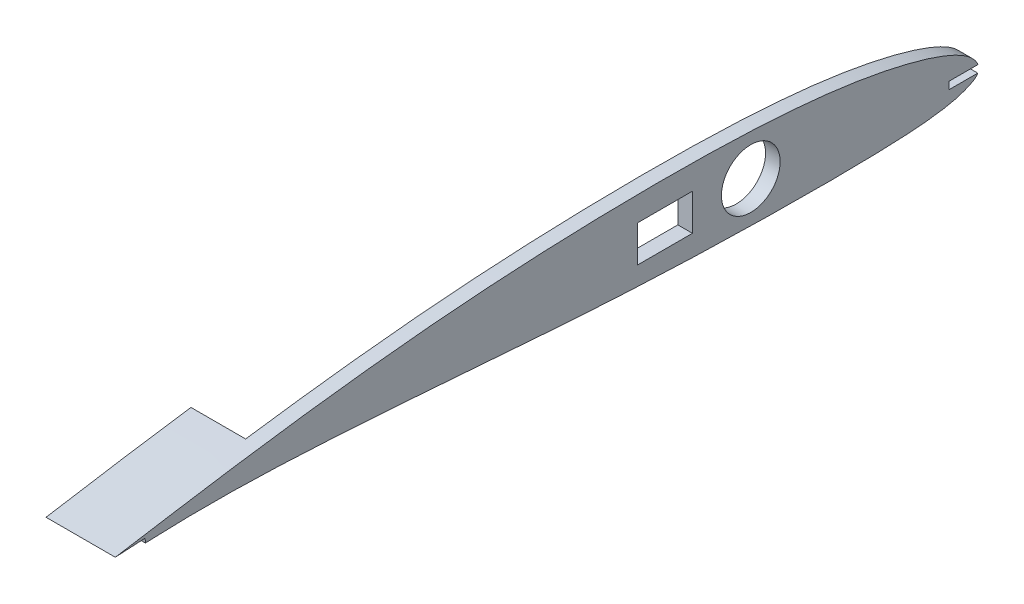
ISO-10303-21;
HEADER;
FILE_DESCRIPTION(('STEP AP214'),'2;1');
FILE_NAME('part.step','',(''),(''),'','','');
FILE_SCHEMA(('AUTOMOTIVE_DESIGN { 1 0 10303 214 1 1 1 1 }'));
ENDSEC;
DATA;
#1=APPLICATION_CONTEXT('core data for automotive mechanical design processes');
#2=APPLICATION_PROTOCOL_DEFINITION('international standard','automotive_design',2000,#1);
#3=PRODUCT_CONTEXT('',#1,'mechanical');
#4=PRODUCT('Part','Part','',(#3));
#5=PRODUCT_RELATED_PRODUCT_CATEGORY('part','',(#4));
#6=PRODUCT_DEFINITION_FORMATION('','',#4);
#7=PRODUCT_DEFINITION_CONTEXT('part definition',#1,'design');
#8=PRODUCT_DEFINITION('design','',#6,#7);
#9=PRODUCT_DEFINITION_SHAPE('','',#8);
#10=(LENGTH_UNIT() NAMED_UNIT(*) SI_UNIT(.MILLI.,.METRE.));
#11=(NAMED_UNIT(*) PLANE_ANGLE_UNIT() SI_UNIT($,.RADIAN.));
#12=(NAMED_UNIT(*) SI_UNIT($,.STERADIAN.) SOLID_ANGLE_UNIT());
#13=UNCERTAINTY_MEASURE_WITH_UNIT(LENGTH_MEASURE(1.E-05),#10,'distance_accuracy_value','');
#14=(GEOMETRIC_REPRESENTATION_CONTEXT(3) GLOBAL_UNCERTAINTY_ASSIGNED_CONTEXT((#13)) GLOBAL_UNIT_ASSIGNED_CONTEXT((#10,
#11,#12)) REPRESENTATION_CONTEXT('',''));
#15=CARTESIAN_POINT('',(0.,0.,0.));
#16=DIRECTION('',(0.,0.,1.));
#17=DIRECTION('',(1.,0.,0.));
#18=AXIS2_PLACEMENT_3D('',#15,#16,#17);
#19=CARTESIAN_POINT('',(4.,0.,250.));
#20=CARTESIAN_POINT('',(4.,-0.0080427959719715,250.000228293678));
#21=CARTESIAN_POINT('',(4.,0.172375657967406,248.284955515532));
#22=CARTESIAN_POINT('',(4.,0.308690014795419,246.518112419387));
#23=CARTESIAN_POINT('',(4.,0.685693593852336,242.189387343398));
#24=CARTESIAN_POINT('',(4.,1.07410152891603,236.806461263496));
#25=CARTESIAN_POINT('',(4.,1.49731723995003,229.680385951639));
#26=CARTESIAN_POINT('',(4.,1.8232186026768,221.18415869828));
#27=CARTESIAN_POINT('',(4.,1.96762610068065,211.337618207726));
#28=CARTESIAN_POINT('',(4.,1.83322105638369,200.371188527109));
#29=CARTESIAN_POINT('',(4.,1.38960528984164,188.499913622482));
#30=CARTESIAN_POINT('',(4.,0.706014078000893,175.953687417433));
#31=CARTESIAN_POINT('',(4.,-0.160208641561513,162.931424917666));
#32=CARTESIAN_POINT('',(4.,-1.14801632724376,149.615771743617));
#33=CARTESIAN_POINT('',(4.,-2.19092490983926,136.176354994724));
#34=CARTESIAN_POINT('',(4.,-3.21958397917046,122.767140548026));
#35=CARTESIAN_POINT('',(4.,-4.15274312671142,109.520053587455));
#36=CARTESIAN_POINT('',(4.,-4.93856436487493,96.5460959745437));
#37=CARTESIAN_POINT('',(4.,-5.53683070268675,83.9408193016427));
#38=CARTESIAN_POINT('',(4.,-5.94764820461108,71.8018392906514));
#39=CARTESIAN_POINT('',(4.,-6.21845093878312,60.2452560030716));
#40=CARTESIAN_POINT('',(4.,-6.35536975583973,49.3987328907547));
#41=CARTESIAN_POINT('',(4.,-6.38138796281789,39.3972261942655));
#42=CARTESIAN_POINT('',(4.,-6.26504923032313,30.3619348419668));
#43=CARTESIAN_POINT('',(4.,-6.01216491688521,22.4121811031587));
#44=CARTESIAN_POINT('',(4.,-5.59743390072595,15.6262272306516));
#45=CARTESIAN_POINT('',(4.,-4.92870657935606,10.0719075109048));
#46=CARTESIAN_POINT('',(4.,-4.04044698146404,5.69769261214423));
#47=CARTESIAN_POINT('',(4.,-2.8657529844069,2.62532063874475));
#48=CARTESIAN_POINT('',(4.,-1.7115284699546,0.494884225045661));
#49=CARTESIAN_POINT('',(4.,-0.410454230626488,-0.0213125491030087));
#50=CARTESIAN_POINT('',(4.,0.792659826704065,0.0311691995850224));
#51=CARTESIAN_POINT('',(4.,2.30568433693192,0.812599241892923));
#52=CARTESIAN_POINT('',(4.,4.23835242447377,2.72886351673443));
#53=CARTESIAN_POINT('',(4.,6.11817212106947,5.76990724125498));
#54=CARTESIAN_POINT('',(4.,7.91359420170391,9.88094280419771));
#55=CARTESIAN_POINT('',(4.,9.64131817838287,15.0749304677094));
#56=CARTESIAN_POINT('',(4.,11.2838964878058,21.2987522216172));
#57=CARTESIAN_POINT('',(4.,12.7883817585812,28.4971721202648));
#58=CARTESIAN_POINT('',(4.,14.0978349081275,36.6073734062479));
#59=CARTESIAN_POINT('',(4.,15.1594290171638,45.573028440303));
#60=CARTESIAN_POINT('',(4.,15.9609039979753,55.3329100744701));
#61=CARTESIAN_POINT('',(4.,16.4940697383882,65.8165364983871));
#62=CARTESIAN_POINT('',(4.,16.7919897051422,76.9313762604552));
#63=CARTESIAN_POINT('',(4.,16.864754130909,88.5669490281142));
#64=CARTESIAN_POINT('',(4.,16.7267152914356,100.596999885542));
#65=CARTESIAN_POINT('',(4.,16.3833850637257,112.888825982424));
#66=CARTESIAN_POINT('',(4.,15.825573666627,125.31161581915));
#67=CARTESIAN_POINT('',(4.,15.0523318700684,137.743791097076));
#68=CARTESIAN_POINT('',(4.,14.0593390742259,150.072384382085));
#69=CARTESIAN_POINT('',(4.,12.8815869860292,162.191375055682));
#70=CARTESIAN_POINT('',(4.,11.5492803460744,173.989074322246));
#71=CARTESIAN_POINT('',(4.,10.1162497290333,185.35236444642));
#72=CARTESIAN_POINT('',(4.,8.63237912523508,196.163081697706));
#73=CARTESIAN_POINT('',(4.,7.13151388385034,206.300441402258));
#74=CARTESIAN_POINT('',(4.,5.73122176805054,215.560350587015));
#75=CARTESIAN_POINT('',(4.,4.29329512716244,223.97715704258));
#76=CARTESIAN_POINT('',(4.,3.1818088737293,231.363413336396));
#77=CARTESIAN_POINT('',(4.,2.09894241729889,237.746440904332));
#78=CARTESIAN_POINT('',(4.,1.2458619166603,242.622069365861));
#79=CARTESIAN_POINT('',(4.,0.552864946230777,246.64452933247));
#80=CARTESIAN_POINT('',(4.,0.246216764640028,248.328398440367));
#81=CARTESIAN_POINT('',(4.,0.00797737724443801,249.999773563223));
#82=CARTESIAN_POINT('',(4.,0.,250.));
#83=B_SPLINE_CURVE_WITH_KNOTS('',3,(#19,#20,#21,#22,#23,#24,#25,#26,#27,#28,#29,#30,#31,#32,#33,
#34,#35,#36,#37,#38,#39,#40,#41,#42,#43,#44,#45,#46,#47,#48,#49,#50,#51,#52,#53,#54,#55,#56,#57,
#58,#59,#60,#61,#62,#63,#64,#65,#66,#67,#68,#69,#70,#71,#72,#73,#74,#75,#76,#77,#78,#79,#80,#81,
#82),.UNSPECIFIED.,.T.,.F.,(4,1,1,1,1,1,1,1,1,1,1,1,1,1,1,1,1,1,1,1,1,1,1,1,1,1,1,1,1,1,1,1,1,1,
1,1,1,1,1,1,1,1,1,1,1,1,1,1,1,1,1,1,1,1,1,1,1,1,1,1,1,4),(0.,0.00158888881614516,
0.00632921783555629,0.0142024564897436,0.0251728077530557,0.0391734833267743,0.0560606311759249,
0.0755789238487882,0.0973636066296903,0.120926258366677,0.145825281006277,0.171670911815127,
0.198108536705041,0.22479018357162,0.25139057978404,0.277643490654311,0.303326750051388,
0.328257458029316,0.352272548115194,0.375156061746876,0.396620664402003,0.416422729294005,
0.434304420097656,0.450054679859308,0.463465465082325,0.474478994238096,0.483169222153171,
0.489678354497499,0.494104066315722,0.496910015324886,0.497289784891853,0.501214273282496,
0.506457950332762,0.51335695674223,0.522168631834455,0.53296596992453,0.545689209241574,
0.56022077890382,0.57643892310517,0.594258689005965,0.613600244568652,0.634342385932902,
0.656331109263004,0.679351893859712,0.703152302846811,0.727478208080039,0.7520707394079,
0.776691163534608,0.801140183976245,0.825214386971546,0.848697423570622,0.871352857669295,
0.892947448931157,0.913230871058069,0.931955467148994,0.94834206907442,0.963693004275676,
0.976235918239566,0.986320058750392,0.993788799349345,0.998424034933867,1.),.UNSPECIFIED.);
#84=DIRECTION('',(-1.,0.,0.));
#85=VECTOR('',#84,1.);
#86=SURFACE_OF_LINEAR_EXTRUSION('',#83,#85);
#87=CARTESIAN_POINT('',(4.,1.52622001669928,228.477241343692));
#88=VERTEX_POINT('',#87);
#89=CARTESIAN_POINT('',(4.,-1.00000519343501,0.266537777160356));
#90=VERTEX_POINT('',#89);
#91=EDGE_CURVE('E189',#88,#90,#83,.T.);
#92=ORIENTED_EDGE('',*,*,#91,.F.);
#93=DIRECTION('',(1.,0.,0.));
#94=VECTOR('',#93,1.);
#95=CARTESIAN_POINT('',(-15.,1.52622001669928,228.477241343692));
#96=LINE('',#95,#94);
#97=CARTESIAN_POINT('',(-15.,1.52622001669928,228.477241343692));
#98=VERTEX_POINT('',#97);
#99=EDGE_CURVE('E357',#98,#88,#96,.T.);
#100=ORIENTED_EDGE('',*,*,#99,.F.);
#101=CARTESIAN_POINT('',(-15.,0.,250.));
#102=CARTESIAN_POINT('',(-15.,-0.0080427959719715,250.000228293678));
#103=CARTESIAN_POINT('',(-15.,0.172375657967406,248.284955515532));
#104=CARTESIAN_POINT('',(-15.,0.308690014795419,246.518112419387));
#105=CARTESIAN_POINT('',(-15.,0.685693593852336,242.189387343398));
#106=CARTESIAN_POINT('',(-15.,1.07410152891603,236.806461263496));
#107=CARTESIAN_POINT('',(-15.,1.49731723995003,229.680385951639));
#108=CARTESIAN_POINT('',(-15.,1.8232186026768,221.18415869828));
#109=CARTESIAN_POINT('',(-15.,1.96762610068065,211.337618207726));
#110=CARTESIAN_POINT('',(-15.,1.83322105638369,200.371188527109));
#111=CARTESIAN_POINT('',(-15.,1.38960528984164,188.499913622482));
#112=CARTESIAN_POINT('',(-15.,0.706014078000893,175.953687417433));
#113=CARTESIAN_POINT('',(-15.,-0.160208641561513,162.931424917666));
#114=CARTESIAN_POINT('',(-15.,-1.14801632724376,149.615771743617));
#115=CARTESIAN_POINT('',(-15.,-2.19092490983926,136.176354994724));
#116=CARTESIAN_POINT('',(-15.,-3.21958397917046,122.767140548026));
#117=CARTESIAN_POINT('',(-15.,-4.15274312671142,109.520053587455));
#118=CARTESIAN_POINT('',(-15.,-4.93856436487493,96.5460959745437));
#119=CARTESIAN_POINT('',(-15.,-5.53683070268675,83.9408193016427));
#120=CARTESIAN_POINT('',(-15.,-5.94764820461108,71.8018392906514));
#121=CARTESIAN_POINT('',(-15.,-6.21845093878312,60.2452560030716));
#122=CARTESIAN_POINT('',(-15.,-6.35536975583973,49.3987328907547));
#123=CARTESIAN_POINT('',(-15.,-6.38138796281789,39.3972261942655));
#124=CARTESIAN_POINT('',(-15.,-6.26504923032313,30.3619348419668));
#125=CARTESIAN_POINT('',(-15.,-6.01216491688521,22.4121811031587));
#126=CARTESIAN_POINT('',(-15.,-5.59743390072595,15.6262272306516));
#127=CARTESIAN_POINT('',(-15.,-4.92870657935606,10.0719075109048));
#128=CARTESIAN_POINT('',(-15.,-4.04044698146404,5.69769261214423));
#129=CARTESIAN_POINT('',(-15.,-2.8657529844069,2.62532063874475));
#130=CARTESIAN_POINT('',(-15.,-1.7115284699546,0.494884225045661));
#131=CARTESIAN_POINT('',(-15.,-0.410454230626488,-0.0213125491030087));
#132=CARTESIAN_POINT('',(-15.,0.792659826704065,0.0311691995850224));
#133=CARTESIAN_POINT('',(-15.,2.30568433693192,0.812599241892923));
#134=CARTESIAN_POINT('',(-15.,4.23835242447377,2.72886351673443));
#135=CARTESIAN_POINT('',(-15.,6.11817212106947,5.76990724125498));
#136=CARTESIAN_POINT('',(-15.,7.91359420170391,9.88094280419771));
#137=CARTESIAN_POINT('',(-15.,9.64131817838287,15.0749304677094));
#138=CARTESIAN_POINT('',(-15.,11.2838964878058,21.2987522216172));
#139=CARTESIAN_POINT('',(-15.,12.7883817585812,28.4971721202648));
#140=CARTESIAN_POINT('',(-15.,14.0978349081275,36.6073734062479));
#141=CARTESIAN_POINT('',(-15.,15.1594290171638,45.573028440303));
#142=CARTESIAN_POINT('',(-15.,15.9609039979753,55.3329100744701));
#143=CARTESIAN_POINT('',(-15.,16.4940697383882,65.8165364983871));
#144=CARTESIAN_POINT('',(-15.,16.7919897051422,76.9313762604552));
#145=CARTESIAN_POINT('',(-15.,16.864754130909,88.5669490281142));
#146=CARTESIAN_POINT('',(-15.,16.7267152914356,100.596999885542));
#147=CARTESIAN_POINT('',(-15.,16.3833850637257,112.888825982424));
#148=CARTESIAN_POINT('',(-15.,15.825573666627,125.31161581915));
#149=CARTESIAN_POINT('',(-15.,15.0523318700684,137.743791097076));
#150=CARTESIAN_POINT('',(-15.,14.0593390742259,150.072384382085));
#151=CARTESIAN_POINT('',(-15.,12.8815869860292,162.191375055682));
#152=CARTESIAN_POINT('',(-15.,11.5492803460744,173.989074322246));
#153=CARTESIAN_POINT('',(-15.,10.1162497290333,185.35236444642));
#154=CARTESIAN_POINT('',(-15.,8.63237912523508,196.163081697706));
#155=CARTESIAN_POINT('',(-15.,7.13151388385034,206.300441402258));
#156=CARTESIAN_POINT('',(-15.,5.73122176805054,215.560350587015));
#157=CARTESIAN_POINT('',(-15.,4.29329512716244,223.97715704258));
#158=CARTESIAN_POINT('',(-15.,3.1818088737293,231.363413336396));
#159=CARTESIAN_POINT('',(-15.,2.09894241729889,237.746440904332));
#160=CARTESIAN_POINT('',(-15.,1.2458619166603,242.622069365861));
#161=CARTESIAN_POINT('',(-15.,0.552864946230777,246.64452933247));
#162=CARTESIAN_POINT('',(-15.,0.246216764640028,248.328398440367));
#163=CARTESIAN_POINT('',(-15.,0.00797737724443801,249.999773563223));
#164=CARTESIAN_POINT('',(-15.,0.,250.));
#165=B_SPLINE_CURVE_WITH_KNOTS('',3,(#101,#102,#103,#104,#105,#106,#107,#108,#109,#110,#111,
#112,#113,#114,#115,#116,#117,#118,#119,#120,#121,#122,#123,#124,#125,#126,#127,#128,#129,#130,
#131,#132,#133,#134,#135,#136,#137,#138,#139,#140,#141,#142,#143,#144,#145,#146,#147,#148,#149,
#150,#151,#152,#153,#154,#155,#156,#157,#158,#159,#160,#161,#162,#163,#164),.UNSPECIFIED.,.T.,
.F.,(4,1,1,1,1,1,1,1,1,1,1,1,1,1,1,1,1,1,1,1,1,1,1,1,1,1,1,1,1,1,1,1,1,1,1,1,1,1,1,1,1,1,1,1,1,
1,1,1,1,1,1,1,1,1,1,1,1,1,1,1,1,4),(0.,0.00158888881614516,0.00632921783555629,
0.0142024564897436,0.0251728077530557,0.0391734833267743,0.0560606311759249,0.0755789238487882,
0.0973636066296903,0.120926258366677,0.145825281006277,0.171670911815127,0.198108536705041,
0.22479018357162,0.25139057978404,0.277643490654311,0.303326750051388,0.328257458029316,
0.352272548115194,0.375156061746876,0.396620664402003,0.416422729294005,0.434304420097656,
0.450054679859308,0.463465465082325,0.474478994238096,0.483169222153171,0.489678354497499,
0.494104066315722,0.496910015324886,0.497289784891853,0.501214273282496,0.506457950332762,
0.51335695674223,0.522168631834455,0.53296596992453,0.545689209241574,0.56022077890382,
0.57643892310517,0.594258689005965,0.613600244568652,0.634342385932902,0.656331109263004,
0.679351893859712,0.703152302846811,0.727478208080039,0.7520707394079,0.776691163534608,
0.801140183976245,0.825214386971546,0.848697423570622,0.871352857669295,0.892947448931157,
0.913230871058069,0.931955467148994,0.94834206907442,0.963693004275676,0.976235918239566,
0.986320058750392,0.993788799349345,0.998424034933867,1.),.UNSPECIFIED.);
#166=CARTESIAN_POINT('',(-15.,1.68901098706519,197.));
#167=VERTEX_POINT('',#166);
#168=EDGE_CURVE('E350',#98,#167,#165,.T.);
#169=ORIENTED_EDGE('',*,*,#168,.T.);
#170=DIRECTION('',(-1.,0.,0.));
#171=VECTOR('',#170,1.);
#172=CARTESIAN_POINT('',(-34.3382300855436,1.68901098706519,197.));
#173=LINE('',#172,#171);
#174=CARTESIAN_POINT('',(0.,1.68901098706519,197.));
#175=VERTEX_POINT('',#174);
#176=EDGE_CURVE('E226',#167,#175,#173,.F.);
#177=ORIENTED_EDGE('',*,*,#176,.T.);
#178=CARTESIAN_POINT('',(0.,0.,250.));
#179=CARTESIAN_POINT('',(0.,-0.0080427959719715,250.000228293678));
#180=CARTESIAN_POINT('',(0.,0.172375657967406,248.284955515532));
#181=CARTESIAN_POINT('',(0.,0.308690014795419,246.518112419387));
#182=CARTESIAN_POINT('',(0.,0.685693593852336,242.189387343398));
#183=CARTESIAN_POINT('',(0.,1.07410152891603,236.806461263496));
#184=CARTESIAN_POINT('',(0.,1.49731723995003,229.680385951639));
#185=CARTESIAN_POINT('',(0.,1.8232186026768,221.18415869828));
#186=CARTESIAN_POINT('',(0.,1.96762610068065,211.337618207726));
#187=CARTESIAN_POINT('',(0.,1.83322105638369,200.371188527109));
#188=CARTESIAN_POINT('',(0.,1.38960528984164,188.499913622482));
#189=CARTESIAN_POINT('',(0.,0.706014078000893,175.953687417433));
#190=CARTESIAN_POINT('',(0.,-0.160208641561513,162.931424917666));
#191=CARTESIAN_POINT('',(0.,-1.14801632724376,149.615771743617));
#192=CARTESIAN_POINT('',(0.,-2.19092490983926,136.176354994724));
#193=CARTESIAN_POINT('',(0.,-3.21958397917046,122.767140548026));
#194=CARTESIAN_POINT('',(0.,-4.15274312671142,109.520053587455));
#195=CARTESIAN_POINT('',(0.,-4.93856436487493,96.5460959745437));
#196=CARTESIAN_POINT('',(0.,-5.53683070268675,83.9408193016427));
#197=CARTESIAN_POINT('',(0.,-5.94764820461108,71.8018392906514));
#198=CARTESIAN_POINT('',(0.,-6.21845093878312,60.2452560030716));
#199=CARTESIAN_POINT('',(0.,-6.35536975583973,49.3987328907547));
#200=CARTESIAN_POINT('',(0.,-6.38138796281789,39.3972261942655));
#201=CARTESIAN_POINT('',(0.,-6.26504923032313,30.3619348419668));
#202=CARTESIAN_POINT('',(0.,-6.01216491688521,22.4121811031587));
#203=CARTESIAN_POINT('',(0.,-5.59743390072595,15.6262272306516));
#204=CARTESIAN_POINT('',(0.,-4.92870657935606,10.0719075109048));
#205=CARTESIAN_POINT('',(0.,-4.04044698146404,5.69769261214423));
#206=CARTESIAN_POINT('',(0.,-2.8657529844069,2.62532063874475));
#207=CARTESIAN_POINT('',(0.,-1.7115284699546,0.494884225045661));
#208=CARTESIAN_POINT('',(0.,-0.410454230626488,-0.0213125491030087));
#209=CARTESIAN_POINT('',(0.,0.792659826704065,0.0311691995850224));
#210=CARTESIAN_POINT('',(0.,2.30568433693192,0.812599241892923));
#211=CARTESIAN_POINT('',(0.,4.23835242447377,2.72886351673443));
#212=CARTESIAN_POINT('',(0.,6.11817212106947,5.76990724125498));
#213=CARTESIAN_POINT('',(0.,7.91359420170391,9.88094280419771));
#214=CARTESIAN_POINT('',(0.,9.64131817838287,15.0749304677094));
#215=CARTESIAN_POINT('',(0.,11.2838964878058,21.2987522216172));
#216=CARTESIAN_POINT('',(0.,12.7883817585812,28.4971721202648));
#217=CARTESIAN_POINT('',(0.,14.0978349081275,36.6073734062479));
#218=CARTESIAN_POINT('',(0.,15.1594290171638,45.573028440303));
#219=CARTESIAN_POINT('',(0.,15.9609039979753,55.3329100744701));
#220=CARTESIAN_POINT('',(0.,16.4940697383882,65.8165364983871));
#221=CARTESIAN_POINT('',(0.,16.7919897051422,76.9313762604552));
#222=CARTESIAN_POINT('',(0.,16.864754130909,88.5669490281142));
#223=CARTESIAN_POINT('',(0.,16.7267152914356,100.596999885542));
#224=CARTESIAN_POINT('',(0.,16.3833850637257,112.888825982424));
#225=CARTESIAN_POINT('',(0.,15.825573666627,125.31161581915));
#226=CARTESIAN_POINT('',(0.,15.0523318700684,137.743791097076));
#227=CARTESIAN_POINT('',(0.,14.0593390742259,150.072384382085));
#228=CARTESIAN_POINT('',(0.,12.8815869860292,162.191375055682));
#229=CARTESIAN_POINT('',(0.,11.5492803460744,173.989074322246));
#230=CARTESIAN_POINT('',(0.,10.1162497290333,185.35236444642));
#231=CARTESIAN_POINT('',(0.,8.63237912523508,196.163081697706));
#232=CARTESIAN_POINT('',(0.,7.13151388385034,206.300441402258));
#233=CARTESIAN_POINT('',(0.,5.73122176805054,215.560350587015));
#234=CARTESIAN_POINT('',(0.,4.29329512716244,223.97715704258));
#235=CARTESIAN_POINT('',(0.,3.1818088737293,231.363413336396));
#236=CARTESIAN_POINT('',(0.,2.09894241729889,237.746440904332));
#237=CARTESIAN_POINT('',(0.,1.2458619166603,242.622069365861));
#238=CARTESIAN_POINT('',(0.,0.552864946230777,246.64452933247));
#239=CARTESIAN_POINT('',(0.,0.246216764640028,248.328398440367));
#240=CARTESIAN_POINT('',(0.,0.00797737724443801,249.999773563223));
#241=CARTESIAN_POINT('',(0.,0.,250.));
#242=B_SPLINE_CURVE_WITH_KNOTS('',3,(#178,#179,#180,#181,#182,#183,#184,#185,#186,#187,#188,
#189,#190,#191,#192,#193,#194,#195,#196,#197,#198,#199,#200,#201,#202,#203,#204,#205,#206,#207,
#208,#209,#210,#211,#212,#213,#214,#215,#216,#217,#218,#219,#220,#221,#222,#223,#224,#225,#226,
#227,#228,#229,#230,#231,#232,#233,#234,#235,#236,#237,#238,#239,#240,#241),.UNSPECIFIED.,.T.,
.F.,(4,1,1,1,1,1,1,1,1,1,1,1,1,1,1,1,1,1,1,1,1,1,1,1,1,1,1,1,1,1,1,1,1,1,1,1,1,1,1,1,1,1,1,1,1,
1,1,1,1,1,1,1,1,1,1,1,1,1,1,1,1,4),(0.,0.00158888881614516,0.00632921783555629,
0.0142024564897436,0.0251728077530557,0.0391734833267743,0.0560606311759249,0.0755789238487882,
0.0973636066296903,0.120926258366677,0.145825281006277,0.171670911815127,0.198108536705041,
0.22479018357162,0.25139057978404,0.277643490654311,0.303326750051388,0.328257458029316,
0.352272548115194,0.375156061746876,0.396620664402003,0.416422729294005,0.434304420097656,
0.450054679859308,0.463465465082325,0.474478994238096,0.483169222153171,0.489678354497499,
0.494104066315722,0.496910015324886,0.497289784891853,0.501214273282496,0.506457950332762,
0.51335695674223,0.522168631834455,0.53296596992453,0.545689209241574,0.56022077890382,
0.57643892310517,0.594258689005965,0.613600244568652,0.634342385932902,0.656331109263004,
0.679351893859712,0.703152302846811,0.727478208080039,0.7520707394079,0.776691163534608,
0.801140183976245,0.825214386971546,0.848697423570622,0.871352857669295,0.892947448931157,
0.913230871058069,0.931955467148994,0.94834206907442,0.963693004275676,0.976235918239566,
0.986320058750392,0.993788799349345,0.998424034933867,1.),.UNSPECIFIED.);
#243=CARTESIAN_POINT('',(0.,-1.00000519343501,0.266537777160356));
#244=VERTEX_POINT('',#243);
#245=EDGE_CURVE('E80',#175,#244,#242,.T.);
#246=ORIENTED_EDGE('',*,*,#245,.T.);
#247=DIRECTION('',(-1.,0.,0.));
#248=VECTOR('',#247,1.);
#249=CARTESIAN_POINT('',(4.,-1.00000519343502,0.266537770752891));
#250=LINE('',#249,#248);
#251=EDGE_CURVE('E12',#244,#90,#250,.F.);
#252=ORIENTED_EDGE('',*,*,#251,.T.);
#253=EDGE_LOOP('',(#92,#100,#169,#177,#246,#252));
#254=FACE_BOUND('',#253,.T.);
#255=ADVANCED_FACE('F56',(#254),#86,.F.);
#256=CARTESIAN_POINT('',(0.,1.49711132773622,0.435092083404368));
#257=DIRECTION('',(-1.,0.,0.));
#258=DIRECTION('',(0.,0.,1.));
#259=AXIS2_PLACEMENT_3D('',#256,#257,#258);
#260=PLANE('',#259);
#261=CARTESIAN_POINT('',(0.,5.07732270373844,62.4999197093942));
#262=DIRECTION('',(1.,0.,0.));
#263=DIRECTION('',(0.,0.,-1.));
#264=AXIS2_PLACEMENT_3D('',#261,#262,#263);
#265=CIRCLE('',#264,8.05);
#266=CARTESIAN_POINT('',(0.,5.07732270373844,54.4499197093942));
#267=VERTEX_POINT('',#266);
#268=EDGE_CURVE('E199',#267,#267,#265,.T.);
#269=ORIENTED_EDGE('',*,*,#268,.T.);
#270=EDGE_LOOP('',(#269));
#271=FACE_BOUND('',#270,.T.);
#272=DIRECTION('',(0.,0.,-1.));
#273=VECTOR('',#272,1.);
#274=CARTESIAN_POINT('',(0.,0.0773227037384437,78.4999197093942));
#275=LINE('',#274,#273);
#276=CARTESIAN_POINT('',(0.,0.0773227037384437,93.4999197093942));
#277=VERTEX_POINT('',#276);
#278=CARTESIAN_POINT('',(0.,0.0773227037384437,78.4999197093942));
#279=VERTEX_POINT('',#278);
#280=EDGE_CURVE('E271',#277,#279,#275,.T.);
#281=ORIENTED_EDGE('',*,*,#280,.T.);
#282=DIRECTION('',(0.,1.,0.));
#283=VECTOR('',#282,1.);
#284=CARTESIAN_POINT('',(0.,10.0773227037384,78.4999197093942));
#285=LINE('',#284,#283);
#286=CARTESIAN_POINT('',(0.,10.0773227037384,78.4999197093942));
#287=VERTEX_POINT('',#286);
#288=EDGE_CURVE('E267',#279,#287,#285,.T.);
#289=ORIENTED_EDGE('',*,*,#288,.T.);
#290=DIRECTION('',(0.,0.,1.));
#291=VECTOR('',#290,1.);
#292=CARTESIAN_POINT('',(0.,10.0773227037384,78.4999197093942));
#293=LINE('',#292,#291);
#294=CARTESIAN_POINT('',(0.,10.0773227037384,93.4999197093942));
#295=VERTEX_POINT('',#294);
#296=EDGE_CURVE('E281',#287,#295,#293,.T.);
#297=ORIENTED_EDGE('',*,*,#296,.T.);
#298=DIRECTION('',(0.,-1.,0.));
#299=VECTOR('',#298,1.);
#300=CARTESIAN_POINT('',(0.,10.0773227037384,93.4999197093942));
#301=LINE('',#300,#299);
#302=EDGE_CURVE('E284',#295,#277,#301,.T.);
#303=ORIENTED_EDGE('',*,*,#302,.T.);
#304=EDGE_LOOP('',(#281,#289,#297,#303));
#305=FACE_BOUND('',#304,.T.);
#306=ORIENTED_EDGE('',*,*,#245,.F.);
#307=DIRECTION('',(0.,-0.974013731573075,-0.226488963764448));
#308=VECTOR('',#307,1.);
#309=CARTESIAN_POINT('',(0.,3.41748058964991,197.401923788647));
#310=LINE('',#309,#308);
#311=CARTESIAN_POINT('',(0.,3.41748058964991,197.401923788647));
#312=VERTEX_POINT('',#311);
#313=EDGE_CURVE('E223',#312,#175,#310,.T.);
#314=ORIENTED_EDGE('',*,*,#313,.F.);
#315=CARTESIAN_POINT('',(0.,4.91748058964991,200.));
#316=DIRECTION('',(-1.,0.,0.));
#317=DIRECTION('',(0.,0.,1.));
#318=AXIS2_PLACEMENT_3D('',#315,#316,#317);
#319=CIRCLE('',#318,2.99999999999999);
#320=CARTESIAN_POINT('',(0.,6.41748058964991,197.401923788647));
#321=VERTEX_POINT('',#320);
#322=EDGE_CURVE('E191',#321,#312,#319,.T.);
#323=ORIENTED_EDGE('',*,*,#322,.F.);
#324=DIRECTION('',(0.,-0.981774207848738,0.190051058410583));
#325=VECTOR('',#324,1.);
#326=CARTESIAN_POINT('',(0.,8.49375636792862,197.));
#327=LINE('',#326,#325);
#328=CARTESIAN_POINT('',(0.,8.4937563679284,197.000000000002));
#329=VERTEX_POINT('',#328);
#330=EDGE_CURVE('E180',#329,#321,#327,.T.);
#331=ORIENTED_EDGE('',*,*,#330,.F.);
#332=CARTESIAN_POINT('',(0.,0.999994767868245,0.201514661045841));
#333=VERTEX_POINT('',#332);
#334=EDGE_CURVE('E193',#333,#329,#242,.T.);
#335=ORIENTED_EDGE('',*,*,#334,.F.);
#336=DIRECTION('',(0.,0.,-1.));
#337=VECTOR('',#336,1.);
#338=CARTESIAN_POINT('',(0.,0.999994806564999,8.19991970488098));
#339=LINE('',#338,#337);
#340=CARTESIAN_POINT('',(0.,0.999994806564999,8.19991970488098));
#341=VERTEX_POINT('',#340);
#342=EDGE_CURVE('E218',#341,#333,#339,.T.);
#343=ORIENTED_EDGE('',*,*,#342,.F.);
#344=DIRECTION('',(0.,1.,0.));
#345=VECTOR('',#344,1.);
#346=CARTESIAN_POINT('',(0.,0.999994806564999,8.19991970488098));
#347=LINE('',#346,#345);
#348=CARTESIAN_POINT('',(0.,-1.000005193435,8.19991970488098));
#349=VERTEX_POINT('',#348);
#350=EDGE_CURVE('E248',#349,#341,#347,.T.);
#351=ORIENTED_EDGE('',*,*,#350,.F.);
#352=DIRECTION('',(0.,0.,1.));
#353=VECTOR('',#352,1.);
#354=CARTESIAN_POINT('',(0.,-1.000005193435,8.19991970488098));
#355=LINE('',#354,#353);
#356=EDGE_CURVE('E242',#244,#349,#355,.T.);
#357=ORIENTED_EDGE('',*,*,#356,.F.);
#358=EDGE_LOOP('',(#306,#314,#323,#331,#335,#343,#351,#357));
#359=FACE_BOUND('',#358,.T.);
#360=ADVANCED_FACE('F216',(#271,#305,#359),#260,.T.);
#361=CARTESIAN_POINT('',(0.,4.91748058964991,200.));
#362=DIRECTION('',(-1.,0.,0.));
#363=DIRECTION('',(0.,0.,1.));
#364=AXIS2_PLACEMENT_3D('',#361,#362,#363);
#365=CIRCLE('',#364,1.5);
#366=CARTESIAN_POINT('',(0.,4.91748058964991,201.5));
#367=VERTEX_POINT('',#366);
#368=EDGE_CURVE('E188',#367,#367,#365,.F.);
#369=ORIENTED_EDGE('',*,*,#368,.F.);
#370=EDGE_LOOP('',(#369));
#371=FACE_BOUND('',#370,.T.);
#372=ADVANCED_FACE('F324',(#371),#260,.T.);
#373=CARTESIAN_POINT('',(-15.,8.49375636792862,197.));
#374=VERTEX_POINT('',#373);
#375=CARTESIAN_POINT('',(-15.,2.26814469872655,236.73130384215));
#376=VERTEX_POINT('',#375);
#377=EDGE_CURVE('E179',#374,#376,#165,.T.);
#378=ORIENTED_EDGE('',*,*,#377,.T.);
#379=DIRECTION('',(1.,0.,0.));
#380=VECTOR('',#379,1.);
#381=CARTESIAN_POINT('',(-15.,2.26814469832942,236.731303844473));
#382=LINE('',#381,#380);
#383=CARTESIAN_POINT('',(4.,2.26814469832942,236.731303844473));
#384=VERTEX_POINT('',#383);
#385=EDGE_CURVE('E72',#376,#384,#382,.T.);
#386=ORIENTED_EDGE('',*,*,#385,.T.);
#387=CARTESIAN_POINT('',(4.,0.999994806564998,0.201514661045645));
#388=VERTEX_POINT('',#387);
#389=EDGE_CURVE('E177',#388,#384,#83,.T.);
#390=ORIENTED_EDGE('',*,*,#389,.F.);
#391=DIRECTION('',(-1.,0.,0.));
#392=VECTOR('',#391,1.);
#393=CARTESIAN_POINT('',(4.,0.999994806564999,0.201514676074857));
#394=LINE('',#393,#392);
#395=EDGE_CURVE('E65',#388,#333,#394,.T.);
#396=ORIENTED_EDGE('',*,*,#395,.T.);
#397=ORIENTED_EDGE('',*,*,#334,.T.);
#398=DIRECTION('',(-1.,0.,0.));
#399=VECTOR('',#398,1.);
#400=CARTESIAN_POINT('',(-34.3382300855436,8.49375636792862,197.));
#401=LINE('',#400,#399);
#402=EDGE_CURVE('E234',#374,#329,#401,.F.);
#403=ORIENTED_EDGE('',*,*,#402,.F.);
#404=EDGE_LOOP('',(#378,#386,#390,#396,#397,#403));
#405=FACE_BOUND('',#404,.T.);
#406=ADVANCED_FACE('F58',(#405),#86,.F.);
#407=CARTESIAN_POINT('',(4.,1.49711132773622,0.435092083404368));
#408=DIRECTION('',(-1.,0.,0.));
#409=DIRECTION('',(0.,0.,1.));
#410=AXIS2_PLACEMENT_3D('',#407,#408,#409);
#411=PLANE('',#410);
#412=CARTESIAN_POINT('',(4.,5.07732270373844,62.4999197093942));
#413=DIRECTION('',(1.,0.,0.));
#414=DIRECTION('',(0.,0.,-1.));
#415=AXIS2_PLACEMENT_3D('',#412,#413,#414);
#416=CIRCLE('',#415,8.05);
#417=CARTESIAN_POINT('',(4.,5.07732270373844,54.4499197093942));
#418=VERTEX_POINT('',#417);
#419=EDGE_CURVE('E297',#418,#418,#416,.T.);
#420=ORIENTED_EDGE('',*,*,#419,.F.);
#421=EDGE_LOOP('',(#420));
#422=FACE_BOUND('',#421,.T.);
#423=DIRECTION('',(0.,-0.0556361766390399,0.998451108391888));
#424=VECTOR('',#423,1.);
#425=CARTESIAN_POINT('',(4.,2.72436134676955,228.544004755659));
#426=LINE('',#425,#424);
#427=CARTESIAN_POINT('',(4.,2.72436134676955,228.544004755659));
#428=VERTEX_POINT('',#427);
#429=EDGE_CURVE('E163',#428,#384,#426,.T.);
#430=ORIENTED_EDGE('',*,*,#429,.F.);
#431=DIRECTION('',(0.,0.998451108391887,0.0556361766390622));
#432=VECTOR('',#431,1.);
#433=CARTESIAN_POINT('',(4.,1.52622001669928,228.477241343692));
#434=LINE('',#433,#432);
#435=EDGE_CURVE('E171',#88,#428,#434,.T.);
#436=ORIENTED_EDGE('',*,*,#435,.F.);
#437=ORIENTED_EDGE('',*,*,#91,.T.);
#438=DIRECTION('',(0.,0.,1.));
#439=VECTOR('',#438,1.);
#440=CARTESIAN_POINT('',(4.,-1.000005193435,8.19991970488098));
#441=LINE('',#440,#439);
#442=CARTESIAN_POINT('',(4.,-1.000005193435,8.19991970488098));
#443=VERTEX_POINT('',#442);
#444=EDGE_CURVE('E244',#90,#443,#441,.T.);
#445=ORIENTED_EDGE('',*,*,#444,.T.);
#446=DIRECTION('',(0.,1.,0.));
#447=VECTOR('',#446,1.);
#448=CARTESIAN_POINT('',(4.,0.999994806564999,8.19991970488098));
#449=LINE('',#448,#447);
#450=CARTESIAN_POINT('',(4.,0.999994806564999,8.19991970488098));
#451=VERTEX_POINT('',#450);
#452=EDGE_CURVE('E240',#443,#451,#449,.T.);
#453=ORIENTED_EDGE('',*,*,#452,.T.);
#454=DIRECTION('',(0.,0.,-1.));
#455=VECTOR('',#454,1.);
#456=CARTESIAN_POINT('',(4.,0.999994806564999,8.19991970488098));
#457=LINE('',#456,#455);
#458=EDGE_CURVE('E187',#451,#388,#457,.T.);
#459=ORIENTED_EDGE('',*,*,#458,.T.);
#460=ORIENTED_EDGE('',*,*,#389,.T.);
#461=EDGE_LOOP('',(#430,#436,#437,#445,#453,#459,#460));
#462=FACE_BOUND('',#461,.T.);
#463=DIRECTION('',(0.,1.,0.));
#464=VECTOR('',#463,1.);
#465=CARTESIAN_POINT('',(4.,10.0773227037384,78.4999197093942));
#466=LINE('',#465,#464);
#467=CARTESIAN_POINT('',(4.,0.0773227037384437,78.4999197093942));
#468=VERTEX_POINT('',#467);
#469=CARTESIAN_POINT('',(4.,10.0773227037384,78.4999197093942));
#470=VERTEX_POINT('',#469);
#471=EDGE_CURVE('E268',#468,#470,#466,.T.);
#472=ORIENTED_EDGE('',*,*,#471,.F.);
#473=DIRECTION('',(0.,0.,-1.));
#474=VECTOR('',#473,1.);
#475=CARTESIAN_POINT('',(4.,0.0773227037384437,78.4999197093942));
#476=LINE('',#475,#474);
#477=CARTESIAN_POINT('',(4.,0.0773227037384437,93.4999197093942));
#478=VERTEX_POINT('',#477);
#479=EDGE_CURVE('E276',#478,#468,#476,.T.);
#480=ORIENTED_EDGE('',*,*,#479,.F.);
#481=DIRECTION('',(0.,-1.,0.));
#482=VECTOR('',#481,1.);
#483=CARTESIAN_POINT('',(4.,10.0773227037384,93.4999197093942));
#484=LINE('',#483,#482);
#485=CARTESIAN_POINT('',(4.,10.0773227037384,93.4999197093942));
#486=VERTEX_POINT('',#485);
#487=EDGE_CURVE('E273',#486,#478,#484,.T.);
#488=ORIENTED_EDGE('',*,*,#487,.F.);
#489=DIRECTION('',(0.,0.,1.));
#490=VECTOR('',#489,1.);
#491=CARTESIAN_POINT('',(4.,10.0773227037384,78.4999197093942));
#492=LINE('',#491,#490);
#493=EDGE_CURVE('E270',#470,#486,#492,.T.);
#494=ORIENTED_EDGE('',*,*,#493,.F.);
#495=EDGE_LOOP('',(#472,#480,#488,#494));
#496=FACE_BOUND('',#495,.T.);
#497=ADVANCED_FACE('F183',(#422,#462,#496),#411,.F.);
#498=CARTESIAN_POINT('',(4.,5.07732270373844,62.4999197093942));
#499=DIRECTION('',(-1.,0.,0.));
#500=DIRECTION('',(0.,0.,1.));
#501=AXIS2_PLACEMENT_3D('',#498,#499,#500);
#502=CYLINDRICAL_SURFACE('',#501,8.05);
#503=ORIENTED_EDGE('',*,*,#419,.T.);
#504=EDGE_LOOP('',(#503));
#505=FACE_BOUND('',#504,.T.);
#506=ORIENTED_EDGE('',*,*,#268,.F.);
#507=EDGE_LOOP('',(#506));
#508=FACE_BOUND('',#507,.T.);
#509=ADVANCED_FACE('F306',(#505,#508),#502,.F.);
#510=CARTESIAN_POINT('',(4.,10.0773227037384,78.4999197093942));
#511=DIRECTION('',(0.,0.,1.));
#512=DIRECTION('',(1.,0.,0.));
#513=AXIS2_PLACEMENT_3D('',#510,#511,#512);
#514=PLANE('',#513);
#515=ORIENTED_EDGE('',*,*,#288,.F.);
#516=DIRECTION('',(-1.,0.,0.));
#517=VECTOR('',#516,1.);
#518=CARTESIAN_POINT('',(4.,0.0773227037384437,78.4999197093942));
#519=LINE('',#518,#517);
#520=EDGE_CURVE('E278',#468,#279,#519,.T.);
#521=ORIENTED_EDGE('',*,*,#520,.F.);
#522=ORIENTED_EDGE('',*,*,#471,.T.);
#523=DIRECTION('',(-1.,0.,0.));
#524=VECTOR('',#523,1.);
#525=CARTESIAN_POINT('',(4.,10.0773227037384,78.4999197093942));
#526=LINE('',#525,#524);
#527=EDGE_CURVE('E295',#470,#287,#526,.T.);
#528=ORIENTED_EDGE('',*,*,#527,.T.);
#529=EDGE_LOOP('',(#515,#521,#522,#528));
#530=FACE_BOUND('',#529,.T.);
#531=ADVANCED_FACE('F308',(#530),#514,.T.);
#532=CARTESIAN_POINT('',(4.,10.0773227037384,78.4999197093942));
#533=DIRECTION('',(0.,-1.,0.));
#534=DIRECTION('',(0.,0.,-1.));
#535=AXIS2_PLACEMENT_3D('',#532,#533,#534);
#536=PLANE('',#535);
#537=ORIENTED_EDGE('',*,*,#296,.F.);
#538=ORIENTED_EDGE('',*,*,#527,.F.);
#539=ORIENTED_EDGE('',*,*,#493,.T.);
#540=DIRECTION('',(-1.,0.,0.));
#541=VECTOR('',#540,1.);
#542=CARTESIAN_POINT('',(4.,10.0773227037384,93.4999197093942));
#543=LINE('',#542,#541);
#544=EDGE_CURVE('E293',#486,#295,#543,.T.);
#545=ORIENTED_EDGE('',*,*,#544,.T.);
#546=EDGE_LOOP('',(#537,#538,#539,#545));
#547=FACE_BOUND('',#546,.T.);
#548=ADVANCED_FACE('F314',(#547),#536,.T.);
#549=CARTESIAN_POINT('',(4.,10.0773227037384,93.4999197093942));
#550=DIRECTION('',(0.,0.,-1.));
#551=DIRECTION('',(-1.,0.,0.));
#552=AXIS2_PLACEMENT_3D('',#549,#550,#551);
#553=PLANE('',#552);
#554=ORIENTED_EDGE('',*,*,#302,.F.);
#555=ORIENTED_EDGE('',*,*,#544,.F.);
#556=ORIENTED_EDGE('',*,*,#487,.T.);
#557=DIRECTION('',(-1.,0.,0.));
#558=VECTOR('',#557,1.);
#559=CARTESIAN_POINT('',(4.,0.0773227037384437,93.4999197093942));
#560=LINE('',#559,#558);
#561=EDGE_CURVE('E291',#478,#277,#560,.T.);
#562=ORIENTED_EDGE('',*,*,#561,.T.);
#563=EDGE_LOOP('',(#554,#555,#556,#562));
#564=FACE_BOUND('',#563,.T.);
#565=ADVANCED_FACE('F484',(#564),#553,.T.);
#566=CARTESIAN_POINT('',(4.,0.0773227037384437,78.4999197093942));
#567=DIRECTION('',(0.,1.,0.));
#568=DIRECTION('',(0.,0.,1.));
#569=AXIS2_PLACEMENT_3D('',#566,#567,#568);
#570=PLANE('',#569);
#571=ORIENTED_EDGE('',*,*,#280,.F.);
#572=ORIENTED_EDGE('',*,*,#561,.F.);
#573=ORIENTED_EDGE('',*,*,#479,.T.);
#574=ORIENTED_EDGE('',*,*,#520,.T.);
#575=EDGE_LOOP('',(#571,#572,#573,#574));
#576=FACE_BOUND('',#575,.T.);
#577=ADVANCED_FACE('F339',(#576),#570,.T.);
#578=CARTESIAN_POINT('',(-15.,4.91748058964991,200.));
#579=DIRECTION('',(1.,0.,0.));
#580=DIRECTION('',(0.,0.,-1.));
#581=AXIS2_PLACEMENT_3D('',#578,#579,#580);
#582=CYLINDRICAL_SURFACE('',#581,1.5);
#583=ORIENTED_EDGE('',*,*,#368,.T.);
#584=EDGE_LOOP('',(#583));
#585=FACE_BOUND('',#584,.T.);
#586=CARTESIAN_POINT('',(-15.,4.91748058964991,200.));
#587=DIRECTION('',(-1.,0.,0.));
#588=DIRECTION('',(0.,0.,-1.));
#589=AXIS2_PLACEMENT_3D('',#586,#587,#588);
#590=CIRCLE('',#589,1.5);
#591=CARTESIAN_POINT('',(-15.,4.91748058964991,198.5));
#592=VERTEX_POINT('',#591);
#593=EDGE_CURVE('E263',#592,#592,#590,.T.);
#594=ORIENTED_EDGE('',*,*,#593,.T.);
#595=EDGE_LOOP('',(#594));
#596=FACE_BOUND('',#595,.T.);
#597=ADVANCED_FACE('F335',(#585,#596),#582,.F.);
#598=CARTESIAN_POINT('',(-15.,4.91748058964991,200.));
#599=DIRECTION('',(1.,0.,0.));
#600=DIRECTION('',(0.,0.,-1.));
#601=AXIS2_PLACEMENT_3D('',#598,#599,#600);
#602=PLANE('',#601);
#603=ORIENTED_EDGE('',*,*,#593,.F.);
#604=EDGE_LOOP('',(#603));
#605=FACE_BOUND('',#604,.T.);
#606=ORIENTED_EDGE('',*,*,#168,.F.);
#607=DIRECTION('',(0.,0.998451108391887,0.0556361766390622));
#608=VECTOR('',#607,1.);
#609=CARTESIAN_POINT('',(-15.,1.52622001669928,228.477241343692));
#610=LINE('',#609,#608);
#611=CARTESIAN_POINT('',(-15.,2.72436134676955,228.544004755659));
#612=VERTEX_POINT('',#611);
#613=EDGE_CURVE('E170',#98,#612,#610,.T.);
#614=ORIENTED_EDGE('',*,*,#613,.T.);
#615=DIRECTION('',(0.,-0.0556361766390399,0.998451108391888));
#616=VECTOR('',#615,1.);
#617=CARTESIAN_POINT('',(-15.,2.72436134676955,228.544004755659));
#618=LINE('',#617,#616);
#619=EDGE_CURVE('E359',#612,#376,#618,.T.);
#620=ORIENTED_EDGE('',*,*,#619,.T.);
#621=ORIENTED_EDGE('',*,*,#377,.F.);
#622=DIRECTION('',(0.,0.981774207848738,-0.190051058410583));
#623=VECTOR('',#622,1.);
#624=CARTESIAN_POINT('',(-15.,8.49375636792862,197.));
#625=LINE('',#624,#623);
#626=CARTESIAN_POINT('',(-15.,6.41748058964991,197.401923788647));
#627=VERTEX_POINT('',#626);
#628=EDGE_CURVE('E239',#627,#374,#625,.T.);
#629=ORIENTED_EDGE('',*,*,#628,.F.);
#630=CARTESIAN_POINT('',(-15.,4.91748058964991,200.));
#631=DIRECTION('',(1.,0.,0.));
#632=DIRECTION('',(0.,0.,-1.));
#633=AXIS2_PLACEMENT_3D('',#630,#631,#632);
#634=CIRCLE('',#633,2.99999999999999);
#635=CARTESIAN_POINT('',(-15.,3.41748058964991,197.401923788647));
#636=VERTEX_POINT('',#635);
#637=EDGE_CURVE('E256',#636,#627,#634,.T.);
#638=ORIENTED_EDGE('',*,*,#637,.F.);
#639=DIRECTION('',(0.,0.974013731573075,0.226488963764448));
#640=VECTOR('',#639,1.);
#641=CARTESIAN_POINT('',(-15.,3.41748058964991,197.401923788647));
#642=LINE('',#641,#640);
#643=EDGE_CURVE('E236',#167,#636,#642,.T.);
#644=ORIENTED_EDGE('',*,*,#643,.F.);
#645=EDGE_LOOP('',(#606,#614,#620,#621,#629,#638,#644));
#646=FACE_BOUND('',#645,.T.);
#647=ADVANCED_FACE('F338',(#605,#646),#602,.F.);
#648=CARTESIAN_POINT('',(-15.,4.91748058964991,200.));
#649=DIRECTION('',(1.,0.,0.));
#650=DIRECTION('',(0.,0.,-1.));
#651=AXIS2_PLACEMENT_3D('',#648,#649,#650);
#652=CYLINDRICAL_SURFACE('',#651,2.99999999999999);
#653=DIRECTION('',(1.,0.,0.));
#654=VECTOR('',#653,1.);
#655=CARTESIAN_POINT('',(-15.,6.41748058964991,197.401923788647));
#656=LINE('',#655,#654);
#657=EDGE_CURVE('E259',#627,#321,#656,.T.);
#658=ORIENTED_EDGE('',*,*,#657,.T.);
#659=ORIENTED_EDGE('',*,*,#322,.T.);
#660=DIRECTION('',(1.,0.,0.));
#661=VECTOR('',#660,1.);
#662=CARTESIAN_POINT('',(-15.,3.41748058964991,197.401923788647));
#663=LINE('',#662,#661);
#664=EDGE_CURVE('E260',#636,#312,#663,.T.);
#665=ORIENTED_EDGE('',*,*,#664,.F.);
#666=ORIENTED_EDGE('',*,*,#637,.T.);
#667=EDGE_LOOP('',(#658,#659,#665,#666));
#668=FACE_BOUND('',#667,.T.);
#669=ADVANCED_FACE('F345',(#668),#652,.T.);
#670=CARTESIAN_POINT('',(4.,-1.000005193435,8.19991970488098));
#671=DIRECTION('',(0.,-1.,0.));
#672=DIRECTION('',(0.,0.,-1.));
#673=AXIS2_PLACEMENT_3D('',#670,#671,#672);
#674=PLANE('',#673);
#675=ORIENTED_EDGE('',*,*,#356,.T.);
#676=DIRECTION('',(-1.,0.,0.));
#677=VECTOR('',#676,1.);
#678=CARTESIAN_POINT('',(4.,-1.000005193435,8.19991970488098));
#679=LINE('',#678,#677);
#680=EDGE_CURVE('E253',#443,#349,#679,.T.);
#681=ORIENTED_EDGE('',*,*,#680,.F.);
#682=ORIENTED_EDGE('',*,*,#444,.F.);
#683=ORIENTED_EDGE('',*,*,#251,.F.);
#684=EDGE_LOOP('',(#675,#681,#682,#683));
#685=FACE_BOUND('',#684,.T.);
#686=ADVANCED_FACE('F433',(#685),#674,.F.);
#687=CARTESIAN_POINT('',(4.,0.999994806564999,8.19991970488098));
#688=DIRECTION('',(0.,1.,0.));
#689=DIRECTION('',(0.,0.,1.));
#690=AXIS2_PLACEMENT_3D('',#687,#688,#689);
#691=PLANE('',#690);
#692=ORIENTED_EDGE('',*,*,#458,.F.);
#693=DIRECTION('',(-1.,0.,0.));
#694=VECTOR('',#693,1.);
#695=CARTESIAN_POINT('',(4.,0.999994806564999,8.19991970488098));
#696=LINE('',#695,#694);
#697=EDGE_CURVE('E247',#451,#341,#696,.T.);
#698=ORIENTED_EDGE('',*,*,#697,.T.);
#699=ORIENTED_EDGE('',*,*,#342,.T.);
#700=ORIENTED_EDGE('',*,*,#395,.F.);
#701=EDGE_LOOP('',(#692,#698,#699,#700));
#702=FACE_BOUND('',#701,.T.);
#703=ADVANCED_FACE('F460',(#702),#691,.F.);
#704=CARTESIAN_POINT('',(4.,0.999994806564999,8.19991970488098));
#705=DIRECTION('',(0.,0.,1.));
#706=DIRECTION('',(0.,-1.,0.));
#707=AXIS2_PLACEMENT_3D('',#704,#705,#706);
#708=PLANE('',#707);
#709=ORIENTED_EDGE('',*,*,#350,.T.);
#710=ORIENTED_EDGE('',*,*,#697,.F.);
#711=ORIENTED_EDGE('',*,*,#452,.F.);
#712=ORIENTED_EDGE('',*,*,#680,.T.);
#713=EDGE_LOOP('',(#709,#710,#711,#712));
#714=FACE_BOUND('',#713,.T.);
#715=ADVANCED_FACE('F374',(#714),#708,.F.);
#716=CARTESIAN_POINT('',(-68.6764601710873,3.41748058964991,197.401923788647));
#717=DIRECTION('',(0.,-0.226488963764448,0.974013731573075));
#718=DIRECTION('',(0.,-0.974013731573075,-0.226488963764448));
#719=AXIS2_PLACEMENT_3D('',#716,#717,#718);
#720=PLANE('',#719);
#721=ORIENTED_EDGE('',*,*,#176,.F.);
#722=ORIENTED_EDGE('',*,*,#643,.T.);
#723=ORIENTED_EDGE('',*,*,#664,.T.);
#724=ORIENTED_EDGE('',*,*,#313,.T.);
#725=EDGE_LOOP('',(#721,#722,#723,#724));
#726=FACE_BOUND('',#725,.T.);
#727=ADVANCED_FACE('F366',(#726),#720,.F.);
#728=CARTESIAN_POINT('',(-68.6764601710873,8.49375636792862,197.));
#729=DIRECTION('',(0.,0.190051058410583,0.981774207848738));
#730=DIRECTION('',(0.,-0.981774207848738,0.190051058410583));
#731=AXIS2_PLACEMENT_3D('',#728,#729,#730);
#732=PLANE('',#731);
#733=ORIENTED_EDGE('',*,*,#657,.F.);
#734=ORIENTED_EDGE('',*,*,#628,.T.);
#735=ORIENTED_EDGE('',*,*,#402,.T.);
#736=ORIENTED_EDGE('',*,*,#330,.T.);
#737=EDGE_LOOP('',(#733,#734,#735,#736));
#738=FACE_BOUND('',#737,.T.);
#739=ADVANCED_FACE('F363',(#738),#732,.F.);
#740=CARTESIAN_POINT('',(-15.,1.52622001669928,228.477241343692));
#741=DIRECTION('',(0.,0.0556361766390623,-0.998451108391887));
#742=DIRECTION('',(0.,0.998451108391887,0.0556361766390622));
#743=AXIS2_PLACEMENT_3D('',#740,#741,#742);
#744=PLANE('',#743);
#745=ORIENTED_EDGE('',*,*,#435,.T.);
#746=DIRECTION('',(1.,0.,0.));
#747=VECTOR('',#746,1.);
#748=CARTESIAN_POINT('',(-15.,2.72436134676955,228.544004755659));
#749=LINE('',#748,#747);
#750=EDGE_CURVE('E165',#612,#428,#749,.T.);
#751=ORIENTED_EDGE('',*,*,#750,.F.);
#752=ORIENTED_EDGE('',*,*,#613,.F.);
#753=ORIENTED_EDGE('',*,*,#99,.T.);
#754=EDGE_LOOP('',(#745,#751,#752,#753));
#755=FACE_BOUND('',#754,.T.);
#756=ADVANCED_FACE('F365',(#755),#744,.F.);
#757=CARTESIAN_POINT('',(-15.,2.72436134676955,228.544004755659));
#758=DIRECTION('',(0.,0.998451108391888,0.0556361766390399));
#759=DIRECTION('',(0.,-0.0556361766390399,0.998451108391888));
#760=AXIS2_PLACEMENT_3D('',#757,#758,#759);
#761=PLANE('',#760);
#762=ORIENTED_EDGE('',*,*,#429,.T.);
#763=ORIENTED_EDGE('',*,*,#385,.F.);
#764=ORIENTED_EDGE('',*,*,#619,.F.);
#765=ORIENTED_EDGE('',*,*,#750,.T.);
#766=EDGE_LOOP('',(#762,#763,#764,#765));
#767=FACE_BOUND('',#766,.T.);
#768=ADVANCED_FACE('F164',(#767),#761,.F.);
#769=CLOSED_SHELL('',(#255,#360,#372,#406,#497,#509,#531,#548,#565,#577,#597,#647,#669,#686,
#703,#715,#727,#739,#756,#768));
#770=MANIFOLD_SOLID_BREP('B2',#769);
#771=ADVANCED_BREP_SHAPE_REPRESENTATION('',(#18,#770),#14);
#772=SHAPE_DEFINITION_REPRESENTATION(#9,#771);
ENDSEC;
END-ISO-10303-21;
